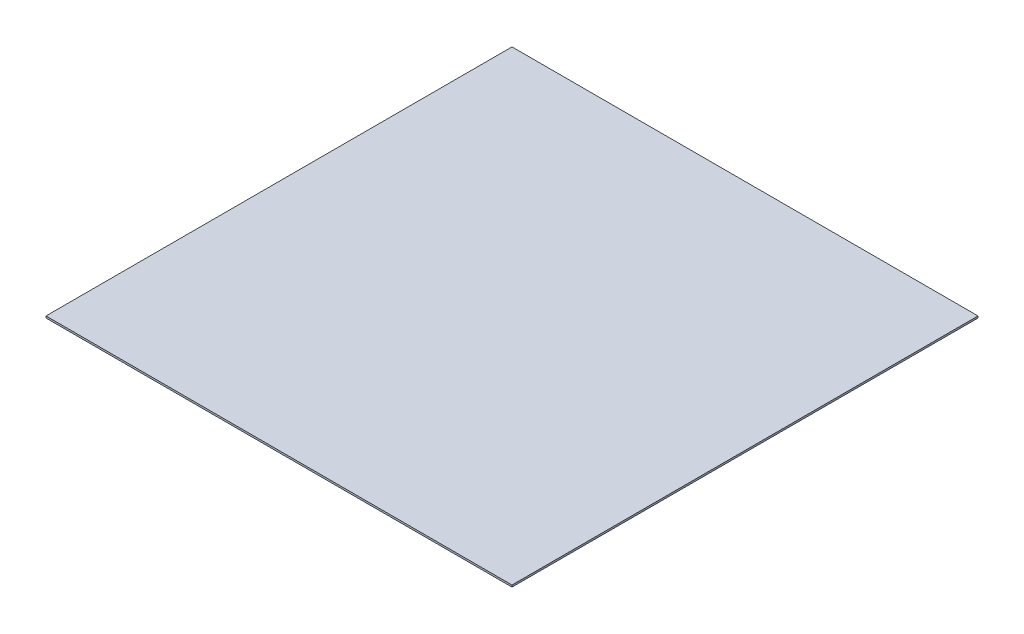
ISO-10303-21;
HEADER;
FILE_DESCRIPTION(('STEP AP214'),'2;1');
FILE_NAME('part.step','',(''),(''),'','','');
FILE_SCHEMA(('AUTOMOTIVE_DESIGN { 1 0 10303 214 1 1 1 1 }'));
ENDSEC;
DATA;
#1=APPLICATION_CONTEXT('core data for automotive mechanical design processes');
#2=APPLICATION_PROTOCOL_DEFINITION('international standard','automotive_design',2000,#1);
#3=PRODUCT_CONTEXT('',#1,'mechanical');
#4=PRODUCT('Part','Part','',(#3));
#5=PRODUCT_RELATED_PRODUCT_CATEGORY('part','',(#4));
#6=PRODUCT_DEFINITION_FORMATION('','',#4);
#7=PRODUCT_DEFINITION_CONTEXT('part definition',#1,'design');
#8=PRODUCT_DEFINITION('design','',#6,#7);
#9=PRODUCT_DEFINITION_SHAPE('','',#8);
#10=(LENGTH_UNIT() NAMED_UNIT(*) SI_UNIT(.MILLI.,.METRE.));
#11=(NAMED_UNIT(*) PLANE_ANGLE_UNIT() SI_UNIT($,.RADIAN.));
#12=(NAMED_UNIT(*) SI_UNIT($,.STERADIAN.) SOLID_ANGLE_UNIT());
#13=UNCERTAINTY_MEASURE_WITH_UNIT(LENGTH_MEASURE(1.E-05),#10,'distance_accuracy_value','');
#14=(GEOMETRIC_REPRESENTATION_CONTEXT(3) GLOBAL_UNCERTAINTY_ASSIGNED_CONTEXT((#13)) GLOBAL_UNIT_ASSIGNED_CONTEXT((#10,
#11,#12)) REPRESENTATION_CONTEXT('',''));
#15=CARTESIAN_POINT('',(0.,0.,0.));
#16=DIRECTION('',(0.,0.,1.));
#17=DIRECTION('',(1.,0.,0.));
#18=AXIS2_PLACEMENT_3D('',#15,#16,#17);
#19=CARTESIAN_POINT('',(-252.,1.,252.));
#20=DIRECTION('',(1.,0.,0.));
#21=DIRECTION('',(0.,0.,-1.));
#22=AXIS2_PLACEMENT_3D('',#19,#20,#21);
#23=PLANE('',#22);
#24=DIRECTION('',(0.,0.,1.));
#25=VECTOR('',#24,1.);
#26=CARTESIAN_POINT('',(-252.,-1.,252.));
#27=LINE('',#26,#25);
#28=CARTESIAN_POINT('',(-252.,-1.,-252.));
#29=VERTEX_POINT('',#28);
#30=CARTESIAN_POINT('',(-252.,-1.,252.));
#31=VERTEX_POINT('',#30);
#32=EDGE_CURVE('E100',#29,#31,#27,.T.);
#33=ORIENTED_EDGE('',*,*,#32,.T.);
#34=DIRECTION('',(0.,-1.,0.));
#35=VECTOR('',#34,1.);
#36=CARTESIAN_POINT('',(-252.,1.,252.));
#37=LINE('',#36,#35);
#38=CARTESIAN_POINT('',(-252.,1.,252.));
#39=VERTEX_POINT('',#38);
#40=EDGE_CURVE('E11',#39,#31,#37,.T.);
#41=ORIENTED_EDGE('',*,*,#40,.F.);
#42=DIRECTION('',(0.,0.,1.));
#43=VECTOR('',#42,1.);
#44=CARTESIAN_POINT('',(-252.,1.,252.));
#45=LINE('',#44,#43);
#46=CARTESIAN_POINT('',(-252.,1.,-252.));
#47=VERTEX_POINT('',#46);
#48=EDGE_CURVE('E88',#47,#39,#45,.T.);
#49=ORIENTED_EDGE('',*,*,#48,.F.);
#50=DIRECTION('',(0.,-1.,0.));
#51=VECTOR('',#50,1.);
#52=CARTESIAN_POINT('',(-252.,1.,-252.));
#53=LINE('',#52,#51);
#54=EDGE_CURVE('E96',#47,#29,#53,.T.);
#55=ORIENTED_EDGE('',*,*,#54,.T.);
#56=EDGE_LOOP('',(#33,#41,#49,#55));
#57=FACE_BOUND('',#56,.T.);
#58=ADVANCED_FACE('F37',(#57),#23,.F.);
#59=CARTESIAN_POINT('',(252.,1.,252.));
#60=DIRECTION('',(0.,0.,-1.));
#61=DIRECTION('',(-1.,0.,0.));
#62=AXIS2_PLACEMENT_3D('',#59,#60,#61);
#63=PLANE('',#62);
#64=DIRECTION('',(1.,0.,0.));
#65=VECTOR('',#64,1.);
#66=CARTESIAN_POINT('',(252.,-1.,252.));
#67=LINE('',#66,#65);
#68=CARTESIAN_POINT('',(252.,-1.,252.));
#69=VERTEX_POINT('',#68);
#70=EDGE_CURVE('E92',#31,#69,#67,.T.);
#71=ORIENTED_EDGE('',*,*,#70,.T.);
#72=DIRECTION('',(0.,-1.,0.));
#73=VECTOR('',#72,1.);
#74=CARTESIAN_POINT('',(252.,1.,252.));
#75=LINE('',#74,#73);
#76=CARTESIAN_POINT('',(252.,1.,252.));
#77=VERTEX_POINT('',#76);
#78=EDGE_CURVE('E45',#77,#69,#75,.T.);
#79=ORIENTED_EDGE('',*,*,#78,.F.);
#80=DIRECTION('',(1.,0.,0.));
#81=VECTOR('',#80,1.);
#82=CARTESIAN_POINT('',(252.,1.,252.));
#83=LINE('',#82,#81);
#84=EDGE_CURVE('E83',#39,#77,#83,.T.);
#85=ORIENTED_EDGE('',*,*,#84,.F.);
#86=ORIENTED_EDGE('',*,*,#40,.T.);
#87=EDGE_LOOP('',(#71,#79,#85,#86));
#88=FACE_BOUND('',#87,.T.);
#89=ADVANCED_FACE('F91',(#88),#63,.F.);
#90=CARTESIAN_POINT('',(252.,1.,252.));
#91=DIRECTION('',(-1.,0.,0.));
#92=DIRECTION('',(0.,0.,1.));
#93=AXIS2_PLACEMENT_3D('',#90,#91,#92);
#94=PLANE('',#93);
#95=DIRECTION('',(0.,0.,-1.));
#96=VECTOR('',#95,1.);
#97=CARTESIAN_POINT('',(252.,-1.,252.));
#98=LINE('',#97,#96);
#99=CARTESIAN_POINT('',(252.,-1.,-252.));
#100=VERTEX_POINT('',#99);
#101=EDGE_CURVE('E70',#69,#100,#98,.T.);
#102=ORIENTED_EDGE('',*,*,#101,.T.);
#103=DIRECTION('',(0.,-1.,0.));
#104=VECTOR('',#103,1.);
#105=CARTESIAN_POINT('',(252.,1.,-252.));
#106=LINE('',#105,#104);
#107=CARTESIAN_POINT('',(252.,1.,-252.));
#108=VERTEX_POINT('',#107);
#109=EDGE_CURVE('E93',#108,#100,#106,.T.);
#110=ORIENTED_EDGE('',*,*,#109,.F.);
#111=DIRECTION('',(0.,0.,-1.));
#112=VECTOR('',#111,1.);
#113=CARTESIAN_POINT('',(252.,1.,252.));
#114=LINE('',#113,#112);
#115=EDGE_CURVE('E86',#77,#108,#114,.T.);
#116=ORIENTED_EDGE('',*,*,#115,.F.);
#117=ORIENTED_EDGE('',*,*,#78,.T.);
#118=EDGE_LOOP('',(#102,#110,#116,#117));
#119=FACE_BOUND('',#118,.T.);
#120=ADVANCED_FACE('F94',(#119),#94,.F.);
#121=CARTESIAN_POINT('',(252.,1.,-252.));
#122=DIRECTION('',(0.,0.,1.));
#123=DIRECTION('',(1.,0.,0.));
#124=AXIS2_PLACEMENT_3D('',#121,#122,#123);
#125=PLANE('',#124);
#126=DIRECTION('',(-1.,0.,0.));
#127=VECTOR('',#126,1.);
#128=CARTESIAN_POINT('',(252.,-1.,-252.));
#129=LINE('',#128,#127);
#130=EDGE_CURVE('E76',#100,#29,#129,.T.);
#131=ORIENTED_EDGE('',*,*,#130,.T.);
#132=ORIENTED_EDGE('',*,*,#54,.F.);
#133=DIRECTION('',(-1.,0.,0.));
#134=VECTOR('',#133,1.);
#135=CARTESIAN_POINT('',(252.,1.,-252.));
#136=LINE('',#135,#134);
#137=EDGE_CURVE('E53',#108,#47,#136,.T.);
#138=ORIENTED_EDGE('',*,*,#137,.F.);
#139=ORIENTED_EDGE('',*,*,#109,.T.);
#140=EDGE_LOOP('',(#131,#132,#138,#139));
#141=FACE_BOUND('',#140,.T.);
#142=ADVANCED_FACE('F107',(#141),#125,.F.);
#143=CARTESIAN_POINT('',(0.,1.,0.));
#144=DIRECTION('',(0.,1.,0.));
#145=DIRECTION('',(0.,0.,1.));
#146=AXIS2_PLACEMENT_3D('',#143,#144,#145);
#147=PLANE('',#146);
#148=ORIENTED_EDGE('',*,*,#48,.T.);
#149=ORIENTED_EDGE('',*,*,#84,.T.);
#150=ORIENTED_EDGE('',*,*,#115,.T.);
#151=ORIENTED_EDGE('',*,*,#137,.T.);
#152=EDGE_LOOP('',(#148,#149,#150,#151));
#153=FACE_BOUND('',#152,.T.);
#154=ADVANCED_FACE('F84',(#153),#147,.T.);
#155=CARTESIAN_POINT('',(0.,-1.,0.));
#156=DIRECTION('',(0.,1.,0.));
#157=DIRECTION('',(0.,0.,1.));
#158=AXIS2_PLACEMENT_3D('',#155,#156,#157);
#159=PLANE('',#158);
#160=ORIENTED_EDGE('',*,*,#32,.F.);
#161=ORIENTED_EDGE('',*,*,#130,.F.);
#162=ORIENTED_EDGE('',*,*,#101,.F.);
#163=ORIENTED_EDGE('',*,*,#70,.F.);
#164=EDGE_LOOP('',(#160,#161,#162,#163));
#165=FACE_BOUND('',#164,.T.);
#166=ADVANCED_FACE('F110',(#165),#159,.F.);
#167=CLOSED_SHELL('',(#58,#89,#120,#142,#154,#166));
#168=MANIFOLD_SOLID_BREP('B2',#167);
#169=ADVANCED_BREP_SHAPE_REPRESENTATION('',(#18,#168),#14);
#170=SHAPE_DEFINITION_REPRESENTATION(#9,#169);
ENDSEC;
END-ISO-10303-21;
